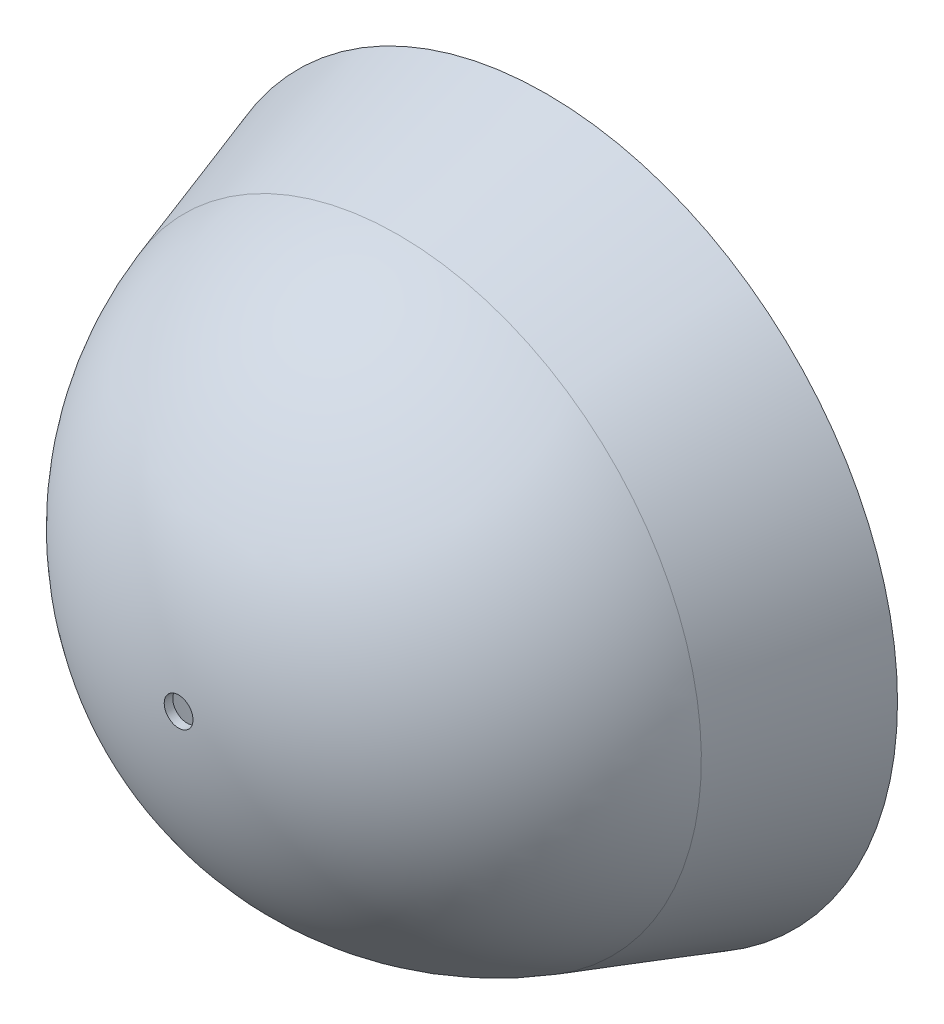
ISO-10303-21;
HEADER;
FILE_DESCRIPTION(('STEP AP214'),'2;1');
FILE_NAME('part.step','',(''),(''),'','','');
FILE_SCHEMA(('AUTOMOTIVE_DESIGN { 1 0 10303 214 1 1 1 1 }'));
ENDSEC;
DATA;
#1=APPLICATION_CONTEXT('core data for automotive mechanical design processes');
#2=APPLICATION_PROTOCOL_DEFINITION('international standard','automotive_design',2000,#1);
#3=PRODUCT_CONTEXT('',#1,'mechanical');
#4=PRODUCT('Part','Part','',(#3));
#5=PRODUCT_RELATED_PRODUCT_CATEGORY('part','',(#4));
#6=PRODUCT_DEFINITION_FORMATION('','',#4);
#7=PRODUCT_DEFINITION_CONTEXT('part definition',#1,'design');
#8=PRODUCT_DEFINITION('design','',#6,#7);
#9=PRODUCT_DEFINITION_SHAPE('','',#8);
#10=(LENGTH_UNIT() NAMED_UNIT(*) SI_UNIT(.MILLI.,.METRE.));
#11=(NAMED_UNIT(*) PLANE_ANGLE_UNIT() SI_UNIT($,.RADIAN.));
#12=(NAMED_UNIT(*) SI_UNIT($,.STERADIAN.) SOLID_ANGLE_UNIT());
#13=UNCERTAINTY_MEASURE_WITH_UNIT(LENGTH_MEASURE(1.E-05),#10,'distance_accuracy_value','');
#14=(GEOMETRIC_REPRESENTATION_CONTEXT(3) GLOBAL_UNCERTAINTY_ASSIGNED_CONTEXT((#13)) GLOBAL_UNIT_ASSIGNED_CONTEXT((#10,
#11,#12)) REPRESENTATION_CONTEXT('',''));
#15=CARTESIAN_POINT('',(0.,0.,0.));
#16=DIRECTION('',(0.,0.,1.));
#17=DIRECTION('',(1.,0.,0.));
#18=AXIS2_PLACEMENT_3D('',#15,#16,#17);
#19=CARTESIAN_POINT('',(0.,0.,-76.2));
#20=DIRECTION('',(0.,0.,-1.));
#21=DIRECTION('',(0.,1.,0.));
#22=AXIS2_PLACEMENT_3D('',#19,#20,#21);
#23=SPHERICAL_SURFACE('',#22,81.5594);
#24=CARTESIAN_POINT('',(0.,0.,5.27620044749261));
#25=DIRECTION('',(0.,0.,-1.));
#26=DIRECTION('',(-1.,0.,0.));
#27=AXIS2_PLACEMENT_3D('',#24,#25,#26);
#28=CIRCLE('',#27,3.683);
#29=CARTESIAN_POINT('',(0.,3.68299999999996,5.27620044749262));
#30=VERTEX_POINT('',#29);
#31=EDGE_CURVE('E49',#30,#30,#28,.F.);
#32=CARTESIAN_POINT('',(0.,0.,-50.9967593489764));
#33=DIRECTION('',(0.,0.,-1.));
#34=DIRECTION('',(-1.,0.,0.));
#35=AXIS2_PLACEMENT_3D('',#32,#33,#34);
#36=CIRCLE('',#35,77.5675988351231);
#37=CARTESIAN_POINT('',(0.,77.5675988351231,-50.9967593489764));
#38=VERTEX_POINT('',#37);
#39=EDGE_CURVE('E39',#38,#38,#36,.T.);
#40=CARTESIAN_POINT('',(0.,3.68299999999996,5.27620044749262));
#41=CARTESIAN_POINT('',(0.,4.71118330516639,5.22973311316401));
#42=CARTESIAN_POINT('',(0.,5.73848528932323,5.16378354385384));
#43=CARTESIAN_POINT('',(0.,7.78985806484101,4.9930583285565));
#44=CARTESIAN_POINT('',(0.,8.81392885620195,4.88828268256935));
#45=CARTESIAN_POINT('',(0.,10.8573706953513,4.64004370720423));
#46=CARTESIAN_POINT('',(0.,11.8767417431396,4.49658037782627));
#47=CARTESIAN_POINT('',(0.,13.9093235202127,4.17117478028761));
#48=CARTESIAN_POINT('',(0.,14.9225342494974,3.98923251212691));
#49=CARTESIAN_POINT('',(0.,16.941343310384,3.58712893008389));
#50=CARTESIAN_POINT('',(0.,17.946941641986,3.36696761620156));
#51=CARTESIAN_POINT('',(0.,19.9490848265616,2.88874167701966));
#52=CARTESIAN_POINT('',(0.,20.9456296795352,2.63067705172009));
#53=CARTESIAN_POINT('',(0.,22.9282377763704,2.07701425555363));
#54=CARTESIAN_POINT('',(0.,23.9143010202319,1.78141608468676));
#55=CARTESIAN_POINT('',(0.,25.8745327957072,1.15310982854598));
#56=CARTESIAN_POINT('',(0.,26.848701327321,0.820401743272069));
#57=CARTESIAN_POINT('',(0.,28.7837476194892,0.118352450247255));
#58=CARTESIAN_POINT('',(0.,29.7446253800435,-0.250988757503651));
#59=CARTESIAN_POINT('',(0.,31.6517131184377,-1.02577499995191));
#60=CARTESIAN_POINT('',(0.,32.5979230962774,-1.43122003464926));
#61=CARTESIAN_POINT('',(0.,34.4743192775253,-2.27763289737685));
#62=CARTESIAN_POINT('',(0.,35.4045054809334,-2.7186007254071));
#63=CARTESIAN_POINT('',(0.,37.2475210849353,-3.63542723389508));
#64=CARTESIAN_POINT('',(0.,38.160350485529,-4.11128591435281));
#65=CARTESIAN_POINT('',(0.,39.9673443291444,-5.09721218562087));
#66=CARTESIAN_POINT('',(0.,40.861508772166,-5.60727977643118));
#67=CARTESIAN_POINT('',(0.,42.6298912942018,-6.66089290230072));
#68=CARTESIAN_POINT('',(0.,43.504109373216,-7.20443843735995));
#69=CARTESIAN_POINT('',(0.,45.2313463454751,-8.3242285091617));
#70=CARTESIAN_POINT('',(0.,46.08436523872,-8.90047304590422));
#71=CARTESIAN_POINT('',(0.,47.767981397743,-10.0848353183199));
#72=CARTESIAN_POINT('',(0.,48.5985786635211,-10.6929530539931));
#73=CARTESIAN_POINT('',(0.,50.2361612578299,-11.9401902447719));
#74=CARTESIAN_POINT('',(0.,51.0431465863606,-12.5793096998775));
#75=CARTESIAN_POINT('',(0.,52.6323488341168,-13.8876344221738));
#76=CARTESIAN_POINT('',(0.,53.4145657533423,-14.5568396893646));
#77=CARTESIAN_POINT('',(0.,54.9531102054656,-15.9243770132008));
#78=CARTESIAN_POINT('',(0.,55.7094377383634,-16.6227090698464));
#79=CARTESIAN_POINT('',(0.,57.1951195422933,-18.0474992090311));
#80=CARTESIAN_POINT('',(0.,57.9244738133253,-18.7739572915702));
#81=CARTESIAN_POINT('',(0.,59.3551638727377,-20.2539584122249));
#82=CARTESIAN_POINT('',(0.,60.0564996611179,-21.0075014503404));
#83=CARTESIAN_POINT('',(0.,61.4301476871087,-22.5405925969956));
#84=CARTESIAN_POINT('',(0.,62.1024599247191,-23.3201407055352));
#85=CARTESIAN_POINT('',(0.,63.4170973739331,-24.9041248406566));
#86=CARTESIAN_POINT('',(0.,64.0594225855367,-25.7085608672384));
#87=CARTESIAN_POINT('',(0.,65.3131654815884,-27.3411680196239));
#88=CARTESIAN_POINT('',(0.,65.9245831660365,-28.1693391454276));
#89=CARTESIAN_POINT('',(0.,67.1156347981,-29.848229663725));
#90=CARTESIAN_POINT('',(0.,67.6952687457156,-30.6989490562188));
#91=CARTESIAN_POINT('',(0.,68.8219222481742,-32.4217169600545));
#92=CARTESIAN_POINT('',(0.,69.3689418030173,-33.2937654713965));
#93=CARTESIAN_POINT('',(0.,70.4295825835288,-35.0579419059436));
#94=CARTESIAN_POINT('',(0.,70.9432038091971,-35.9500698291486));
#95=CARTESIAN_POINT('',(0.,71.9363119297206,-37.7531265785049));
#96=CARTESIAN_POINT('',(0.,72.4157988245756,-38.6640554046562));
#97=CARTESIAN_POINT('',(0.,73.3399509287973,-40.5034086070816));
#98=CARTESIAN_POINT('',(0.,73.784616138164,-41.4318329833557));
#99=CARTESIAN_POINT('',(0.,74.6384884271335,-43.304846490389));
#100=CARTESIAN_POINT('',(0.,75.0476955067363,-44.2494356211481));
#101=CARTESIAN_POINT('',(0.,75.8300621433073,-46.1534260583238));
#102=CARTESIAN_POINT('',(0.,76.2032217002756,-47.1128273647404));
#103=CARTESIAN_POINT('',(0.,76.9129696006264,-49.0450631891732));
#104=CARTESIAN_POINT('',(0.,77.249557944009,-50.0178977071894));
#105=CARTESIAN_POINT('',(0.,77.5675988351231,-50.9967593489764));
#106=B_SPLINE_CURVE_WITH_KNOTS('',3,(#40,#41,#42,#43,#44,#45,#46,#47,#48,#49,#50,#51,#52,#53,
#54,#55,#56,#57,#58,#59,#60,#61,#62,#63,#64,#65,#66,#67,#68,#69,#70,#71,#72,#73,#74,#75,#76,#77,
#78,#79,#80,#81,#82,#83,#84,#85,#86,#87,#88,#89,#90,#91,#92,#93,#94,#95,#96,#97,#98,#99,#100,
#101,#102,#103,#104,#105),.UNSPECIFIED.,.F.,.F.,(4,2,2,2,2,2,2,2,2,2,2,2,2,2,2,2,2,2,2,2,2,2,2,
2,2,2,2,2,2,2,2,2,4),(0.,3.08751285644908,6.17502571289817,9.26253856934727,12.3500514257963,
15.4375642822454,18.5250771386945,21.6125899951436,24.7001028515927,27.7876157080418,
30.8751285644909,33.96264142094,37.050154277389,40.1376671338381,43.2251799902872,
46.3126928467363,49.4002057031854,52.4877185596345,55.5752314160836,58.6627442725326,
61.7502571289817,64.8377699854308,67.9252828418799,71.012795698329,74.1003085547781,
77.1878214112271,80.2753342676762,83.3628471241253,86.4503599805744,89.5378728370235,
92.6253856934726,95.7128985499217,98.8004114063707),.UNSPECIFIED.);
#107=EDGE_CURVE('BSEAM32',#30,#38,#106,.T.);
#108=ORIENTED_EDGE('',*,*,#31,.F.);
#109=ORIENTED_EDGE('',*,*,#39,.F.);
#110=ORIENTED_EDGE('',*,*,#107,.T.);
#111=ORIENTED_EDGE('',*,*,#107,.F.);
#112=EDGE_LOOP('',(#108,#110,#109,#111));
#113=FACE_BOUND('',#112,.T.);
#114=ADVANCED_FACE('F32',(#113),#23,.T.);
#115=CARTESIAN_POINT('',(0.,0.,-94.1360005375122));
#116=DIRECTION('',(0.,0.,-1.));
#117=DIRECTION('',(-1.,0.,0.));
#118=AXIS2_PLACEMENT_3D('',#115,#116,#117);
#119=CONICAL_SURFACE('',#118,91.5843879778199,0.314159265358973);
#120=CARTESIAN_POINT('',(0.,0.,-88.9));
#121=DIRECTION('',(0.,0.,1.));
#122=DIRECTION('',(1.,0.,0.));
#123=AXIS2_PLACEMENT_3D('',#120,#121,#122);
#124=CIRCLE('',#123,89.8831082736962);
#125=CARTESIAN_POINT('',(89.8831082736962,0.,-88.9));
#126=VERTEX_POINT('',#125);
#127=EDGE_CURVE('E47',#126,#126,#124,.F.);
#128=ORIENTED_EDGE('',*,*,#127,.F.);
#129=EDGE_LOOP('',(#128));
#130=FACE_BOUND('',#129,.T.);
#131=ORIENTED_EDGE('',*,*,#39,.T.);
#132=EDGE_LOOP('',(#131));
#133=FACE_BOUND('',#132,.T.);
#134=ADVANCED_FACE('F73',(#130,#133),#119,.T.);
#135=CARTESIAN_POINT('',(0.,92.9277222902005,-88.9));
#136=DIRECTION('',(0.,0.,1.));
#137=DIRECTION('',(1.,0.,0.));
#138=AXIS2_PLACEMENT_3D('',#135,#136,#137);
#139=PLANE('',#138);
#140=ORIENTED_EDGE('',*,*,#127,.T.);
#141=EDGE_LOOP('',(#140));
#142=FACE_BOUND('',#141,.T.);
#143=CARTESIAN_POINT('',(0.,0.,-88.9));
#144=DIRECTION('',(0.,0.,1.));
#145=DIRECTION('',(1.,0.,0.));
#146=AXIS2_PLACEMENT_3D('',#143,#144,#145);
#147=CIRCLE('',#146,87.5862941910701);
#148=CARTESIAN_POINT('',(87.5862941910701,0.,-88.9));
#149=VERTEX_POINT('',#148);
#150=EDGE_CURVE('E44',#149,#149,#147,.F.);
#151=ORIENTED_EDGE('',*,*,#150,.F.);
#152=EDGE_LOOP('',(#151));
#153=FACE_BOUND('',#152,.T.);
#154=ADVANCED_FACE('F78',(#142,#153),#139,.F.);
#155=CARTESIAN_POINT('',(0.,0.,-76.2));
#156=DIRECTION('',(0.,0.,-1.));
#157=DIRECTION('',(0.,1.,0.));
#158=AXIS2_PLACEMENT_3D('',#155,#156,#157);
#159=SPHERICAL_SURFACE('',#158,79.375);
#160=CARTESIAN_POINT('',(0.,0.,3.08950836018593));
#161=DIRECTION('',(0.,0.,-1.));
#162=DIRECTION('',(-1.,0.,0.));
#163=AXIS2_PLACEMENT_3D('',#160,#161,#162);
#164=CIRCLE('',#163,3.683);
#165=CARTESIAN_POINT('',(0.,3.68300000000009,3.08950836018594));
#166=VERTEX_POINT('',#165);
#167=EDGE_CURVE('E35',#166,#166,#164,.F.);
#168=CARTESIAN_POINT('',(0.,0.,-51.671776071489));
#169=DIRECTION('',(0.,0.,-1.));
#170=DIRECTION('',(-1.,0.,0.));
#171=AXIS2_PLACEMENT_3D('',#168,#169,#170);
#172=CIRCLE('',#171,75.4901109809279);
#173=CARTESIAN_POINT('',(0.,75.4901109809279,-51.671776071489));
#174=VERTEX_POINT('',#173);
#175=EDGE_CURVE('E10',#174,#174,#172,.T.);
#176=CARTESIAN_POINT('',(0.,3.68300000000009,3.08950836018594));
#177=CARTESIAN_POINT('',(0.,4.68256101662574,3.04308844412997));
#178=CARTESIAN_POINT('',(0.,5.6812425427109,2.97774812338822));
#179=CARTESIAN_POINT('',(0.,7.6754219546763,2.8093626458025));
#180=CARTESIAN_POINT('',(0.,8.67091984055654,2.70631748895852));
#181=CARTESIAN_POINT('',(0.,10.6573073129881,2.46265831243762));
#182=CARTESIAN_POINT('',(0.,11.6481968995395,2.32204429276069));
#183=CARTESIAN_POINT('',(0.,13.6239509246648,2.00345154104276));
#184=CARTESIAN_POINT('',(0.,14.6088153632388,1.82547280900176));
#185=CARTESIAN_POINT('',(0.,16.5711105336461,1.4324043481301));
#186=CARTESIAN_POINT('',(0.,17.5485412654795,1.21731461929945));
#187=CARTESIAN_POINT('',(0.,19.4945711824417,0.750331991545305));
#188=CARTESIAN_POINT('',(0.,20.4631703675705,0.498439092621813));
#189=CARTESIAN_POINT('',(0.,22.390151957999,-0.0417896930591219));
#190=CARTESIAN_POINT('',(0.,23.3485343632987,-0.330125579816565));
#191=CARTESIAN_POINT('',(0.,25.2537117786137,-0.94282796601317));
#192=CARTESIAN_POINT('',(0.,26.2005067886289,-1.26719446545233));
#193=CARTESIAN_POINT('',(0.,28.0811553677807,-1.95149419315547));
#194=CARTESIAN_POINT('',(0.,29.0150089369173,-2.31142742141946));
#195=CARTESIAN_POINT('',(0.,30.8684390971845,-3.06634585232327));
#196=CARTESIAN_POINT('',(0.,31.7880156883151,-3.4613310549631));
#197=CARTESIAN_POINT('',(0.,33.6115767733362,-4.28578855252655));
#198=CARTESIAN_POINT('',(0.,34.5155612672267,-4.71526084745017));
#199=CARTESIAN_POINT('',(0.,36.306645337379,-5.60807832588719));
#200=CARTESIAN_POINT('',(0.,37.1937449136408,-6.07142350940058));
#201=CARTESIAN_POINT('',(0.,38.9497904758603,-7.03132411860259));
#202=CARTESIAN_POINT('',(0.,39.8187364618179,-7.52787954429121));
#203=CARTESIAN_POINT('',(0.,41.5372321328511,-8.55349049625234));
#204=CARTESIAN_POINT('',(0.,42.3867818179267,-9.08254602252485));
#205=CARTESIAN_POINT('',(0.,44.0652699159578,-10.1724005545194));
#206=CARTESIAN_POINT('',(0.,44.8942083289132,-10.7331995602414));
#207=CARTESIAN_POINT('',(0.,46.5302883883796,-11.885739032519));
#208=CARTESIAN_POINT('',(0.,47.3374300348906,-12.4774794990745));
#209=CARTESIAN_POINT('',(0.,48.9287622394751,-13.6910556239193));
#210=CARTESIAN_POINT('',(0.,49.7129527975487,-14.3128912822087));
#211=CARTESIAN_POINT('',(0.,51.2572613264339,-15.5857684812164));
#212=CARTESIAN_POINT('',(0.,52.0173792972455,-16.2368100219348));
#213=CARTESIAN_POINT('',(0.,53.5124555798458,-17.5671679081246));
#214=CARTESIAN_POINT('',(0.,54.2474138916343,-18.2464842535959));
#215=CARTESIAN_POINT('',(0.,55.6911197661526,-19.63242023481));
#216=CARTESIAN_POINT('',(0.,56.3998673288824,-20.3390398705528));
#217=CARTESIAN_POINT('',(0.,57.7901381001656,-21.7785718704238));
#218=CARTESIAN_POINT('',(0.,58.471661308719,-22.5114842345521));
#219=CARTESIAN_POINT('',(0.,59.8065087010757,-24.0025535271319));
#220=CARTESIAN_POINT('',(0.,60.4598328848789,-24.7607104555836));
#221=CARTESIAN_POINT('',(0.,61.7373478854932,-26.3011846096339));
#222=CARTESIAN_POINT('',(0.,62.3615387023043,-27.0835018352327));
#223=CARTESIAN_POINT('',(0.,63.5798942917189,-28.6711777637673));
#224=CARTESIAN_POINT('',(0.,64.1740590643225,-29.4765364667033));
#225=CARTESIAN_POINT('',(0.,65.3315128280715,-31.1091435781614));
#226=CARTESIAN_POINT('',(0.,65.8948018192168,-31.9363919866837));
#227=CARTESIAN_POINT('',(0.,66.9896984443898,-33.6115954304665));
#228=CARTESIAN_POINT('',(0.,67.5213060784175,-34.4595504657271));
#229=CARTESIAN_POINT('',(0.,68.552079703532,-36.1749544777595));
#230=CARTESIAN_POINT('',(0.,69.0512456946189,-37.0424034545314));
#231=CARTESIAN_POINT('',(0.,70.0164222141391,-38.7955547596112));
#232=CARTESIAN_POINT('',(0.,70.4824327425723,-39.6812570879191));
#233=CARTESIAN_POINT('',(0.,71.3806316720308,-41.469648497498));
#234=CARTESIAN_POINT('',(0.,71.8128200730561,-42.372337578769));
#235=CARTESIAN_POINT('',(0.,72.6427574304043,-44.1934112434306));
#236=CARTESIAN_POINT('',(0.,73.0405063867272,-45.1117958268213));
#237=CARTESIAN_POINT('',(0.,73.800993143373,-46.9629481376543));
#238=CARTESIAN_POINT('',(0.,74.1637309436959,-47.8957158650966));
#239=CARTESIAN_POINT('',(0.,74.8536873588268,-49.7742965371435));
#240=CARTESIAN_POINT('',(0.,75.1809059736348,-50.720109481748));
#241=CARTESIAN_POINT('',(0.,75.4901109809279,-51.671776071489));
#242=B_SPLINE_CURVE_WITH_KNOTS('',3,(#176,#177,#178,#179,#180,#181,#182,#183,#184,#185,#186,
#187,#188,#189,#190,#191,#192,#193,#194,#195,#196,#197,#198,#199,#200,#201,#202,#203,#204,#205,
#206,#207,#208,#209,#210,#211,#212,#213,#214,#215,#216,#217,#218,#219,#220,#221,#222,#223,#224,
#225,#226,#227,#228,#229,#230,#231,#232,#233,#234,#235,#236,#237,#238,#239,#240,#241),
.UNSPECIFIED.,.F.,.F.,(4,2,2,2,2,2,2,2,2,2,2,2,2,2,2,2,2,2,2,2,2,2,2,2,2,2,2,2,2,2,2,2,4),(0.,
3.00173497309575,6.0034699461915,9.00520491928726,12.006939892383,15.0086748654788,
18.0104098385745,21.0121448116703,24.013879784766,27.0156147578618,30.0173497309575,
33.0190847040533,36.020819677149,39.0225546502448,42.0242896233405,45.0260245964363,
48.0277595695321,51.0294945426278,54.0312295157236,57.0329644888193,60.0346994619151,
63.0364344350108,66.0381694081066,69.0399043812023,72.0416393542981,75.0433743273938,
78.0451093004896,81.0468442735853,84.0485792466811,87.0503142197769,90.0520491928726,
93.0537841659684,96.0555191390641),.UNSPECIFIED.);
#243=EDGE_CURVE('BSEAM60',#166,#174,#242,.T.);
#244=ORIENTED_EDGE('',*,*,#167,.T.);
#245=ORIENTED_EDGE('',*,*,#175,.T.);
#246=ORIENTED_EDGE('',*,*,#243,.T.);
#247=ORIENTED_EDGE('',*,*,#243,.F.);
#248=EDGE_LOOP('',(#244,#246,#245,#247));
#249=FACE_BOUND('',#248,.T.);
#250=ADVANCED_FACE('F60',(#249),#159,.F.);
#251=CARTESIAN_POINT('',(0.,0.,-94.8110172600248));
#252=DIRECTION('',(0.,0.,-1.));
#253=DIRECTION('',(-1.,0.,0.));
#254=AXIS2_PLACEMENT_3D('',#251,#252,#253);
#255=CONICAL_SURFACE('',#254,89.5069001236248,0.314159265358974);
#256=ORIENTED_EDGE('',*,*,#150,.T.);
#257=EDGE_LOOP('',(#256));
#258=FACE_BOUND('',#257,.T.);
#259=ORIENTED_EDGE('',*,*,#175,.F.);
#260=EDGE_LOOP('',(#259));
#261=FACE_BOUND('',#260,.T.);
#262=ADVANCED_FACE('F64',(#258,#261),#255,.F.);
#263=CARTESIAN_POINT('',(0.,0.,-12.7));
#264=DIRECTION('',(0.,0.,1.));
#265=DIRECTION('',(1.,0.,0.));
#266=AXIS2_PLACEMENT_3D('',#263,#264,#265);
#267=CYLINDRICAL_SURFACE('',#266,3.683);
#268=ORIENTED_EDGE('',*,*,#31,.T.);
#269=EDGE_LOOP('',(#268));
#270=FACE_BOUND('',#269,.T.);
#271=ORIENTED_EDGE('',*,*,#167,.F.);
#272=EDGE_LOOP('',(#271));
#273=FACE_BOUND('',#272,.T.);
#274=ADVANCED_FACE('F62',(#270,#273),#267,.F.);
#275=CLOSED_SHELL('',(#114,#134,#154,#250,#262,#274));
#276=MANIFOLD_SOLID_BREP('B2',#275);
#277=ADVANCED_BREP_SHAPE_REPRESENTATION('',(#18,#276),#14);
#278=SHAPE_DEFINITION_REPRESENTATION(#9,#277);
ENDSEC;
END-ISO-10303-21;
